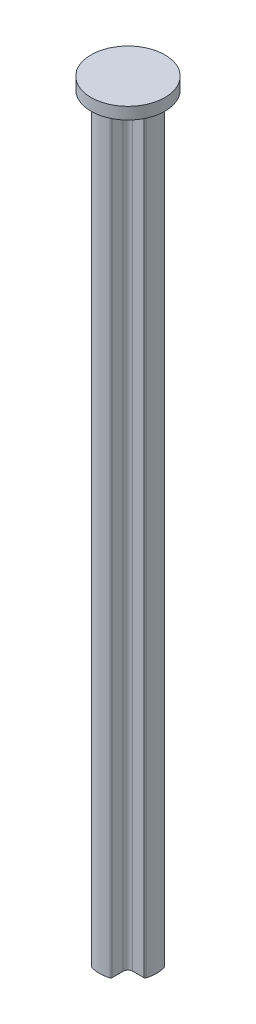
ISO-10303-21;
HEADER;
FILE_DESCRIPTION(('STEP AP214'),'2;1');
FILE_NAME('part.step','',(''),(''),'','','');
FILE_SCHEMA(('AUTOMOTIVE_DESIGN { 1 0 10303 214 1 1 1 1 }'));
ENDSEC;
DATA;
#1=APPLICATION_CONTEXT('core data for automotive mechanical design processes');
#2=APPLICATION_PROTOCOL_DEFINITION('international standard','automotive_design',2000,#1);
#3=PRODUCT_CONTEXT('',#1,'mechanical');
#4=PRODUCT('Part','Part','',(#3));
#5=PRODUCT_RELATED_PRODUCT_CATEGORY('part','',(#4));
#6=PRODUCT_DEFINITION_FORMATION('','',#4);
#7=PRODUCT_DEFINITION_CONTEXT('part definition',#1,'design');
#8=PRODUCT_DEFINITION('design','',#6,#7);
#9=PRODUCT_DEFINITION_SHAPE('','',#8);
#10=(LENGTH_UNIT() NAMED_UNIT(*) SI_UNIT(.MILLI.,.METRE.));
#11=(NAMED_UNIT(*) PLANE_ANGLE_UNIT() SI_UNIT($,.RADIAN.));
#12=(NAMED_UNIT(*) SI_UNIT($,.STERADIAN.) SOLID_ANGLE_UNIT());
#13=UNCERTAINTY_MEASURE_WITH_UNIT(LENGTH_MEASURE(1.E-05),#10,'distance_accuracy_value','');
#14=(GEOMETRIC_REPRESENTATION_CONTEXT(3) GLOBAL_UNCERTAINTY_ASSIGNED_CONTEXT((#13)) GLOBAL_UNIT_ASSIGNED_CONTEXT((#10,
#11,#12)) REPRESENTATION_CONTEXT('',''));
#15=CARTESIAN_POINT('',(0.,0.,0.));
#16=DIRECTION('',(0.,0.,1.));
#17=DIRECTION('',(1.,0.,0.));
#18=AXIS2_PLACEMENT_3D('',#15,#16,#17);
#19=CARTESIAN_POINT('',(0.,64.,0.));
#20=DIRECTION('',(0.,-1.,0.));
#21=DIRECTION('',(0.,0.,-1.));
#22=AXIS2_PLACEMENT_3D('',#19,#20,#21);
#23=CYLINDRICAL_SURFACE('',#22,3.1);
#24=CARTESIAN_POINT('',(0.,63.,0.));
#25=DIRECTION('',(0.,1.,0.));
#26=DIRECTION('',(0.,0.,1.));
#27=AXIS2_PLACEMENT_3D('',#24,#25,#26);
#28=CIRCLE('',#27,3.1);
#29=CARTESIAN_POINT('',(0.,63.,3.1));
#30=VERTEX_POINT('',#29);
#31=EDGE_CURVE('E47',#30,#30,#28,.T.);
#32=ORIENTED_EDGE('',*,*,#31,.T.);
#33=EDGE_LOOP('',(#32));
#34=FACE_BOUND('',#33,.T.);
#35=CARTESIAN_POINT('',(0.,64.,0.));
#36=DIRECTION('',(0.,1.,0.));
#37=DIRECTION('',(0.,0.,1.));
#38=AXIS2_PLACEMENT_3D('',#35,#36,#37);
#39=CIRCLE('',#38,3.1);
#40=CARTESIAN_POINT('',(0.,64.,3.1));
#41=VERTEX_POINT('',#40);
#42=EDGE_CURVE('E11',#41,#41,#39,.T.);
#43=ORIENTED_EDGE('',*,*,#42,.F.);
#44=EDGE_LOOP('',(#43));
#45=FACE_BOUND('',#44,.T.);
#46=ADVANCED_FACE('F39',(#34,#45),#23,.T.);
#47=CARTESIAN_POINT('',(0.,64.,0.));
#48=DIRECTION('',(0.,1.,0.));
#49=DIRECTION('',(0.,0.,1.));
#50=AXIS2_PLACEMENT_3D('',#47,#48,#49);
#51=PLANE('',#50);
#52=ORIENTED_EDGE('',*,*,#42,.T.);
#53=EDGE_LOOP('',(#52));
#54=FACE_BOUND('',#53,.T.);
#55=ADVANCED_FACE('F455',(#54),#51,.T.);
#56=CARTESIAN_POINT('',(0.,63.,0.));
#57=DIRECTION('',(0.,1.,0.));
#58=DIRECTION('',(0.,0.,1.));
#59=AXIS2_PLACEMENT_3D('',#56,#57,#58);
#60=PLANE('',#59);
#61=ORIENTED_EDGE('',*,*,#31,.F.);
#62=EDGE_LOOP('',(#61));
#63=FACE_BOUND('',#62,.T.);
#64=CARTESIAN_POINT('',(0.,63.,0.));
#65=DIRECTION('',(0.,1.,0.));
#66=DIRECTION('',(0.,0.,1.));
#67=AXIS2_PLACEMENT_3D('',#64,#65,#66);
#68=CIRCLE('',#67,2.4);
#69=CARTESIAN_POINT('',(-0.772173913043479,63.,2.27238804961105));
#70=VERTEX_POINT('',#69);
#71=CARTESIAN_POINT('',(0.772173913043478,63.,2.27238804961105));
#72=VERTEX_POINT('',#71);
#73=EDGE_CURVE('E202',#70,#72,#68,.T.);
#74=ORIENTED_EDGE('',*,*,#73,.T.);
#75=CARTESIAN_POINT('',(0.74,63.,2.17770521421059));
#76=DIRECTION('',(0.,1.,0.));
#77=DIRECTION('',(0.,0.,1.));
#78=AXIS2_PLACEMENT_3D('',#75,#76,#77);
#79=CIRCLE('',#78,0.0999999999999998);
#80=CARTESIAN_POINT('',(0.84,63.,2.17770521421059));
#81=VERTEX_POINT('',#80);
#82=EDGE_CURVE('E225',#72,#81,#79,.T.);
#83=ORIENTED_EDGE('',*,*,#82,.T.);
#84=DIRECTION('',(0.,0.,-1.));
#85=VECTOR('',#84,1.);
#86=CARTESIAN_POINT('',(0.84,63.,1.24));
#87=LINE('',#86,#85);
#88=CARTESIAN_POINT('',(0.84,63.,1.24));
#89=VERTEX_POINT('',#88);
#90=EDGE_CURVE('E228',#81,#89,#87,.T.);
#91=ORIENTED_EDGE('',*,*,#90,.T.);
#92=CARTESIAN_POINT('',(1.24,63.,1.24));
#93=DIRECTION('',(0.,-1.,0.));
#94=DIRECTION('',(0.,0.,1.));
#95=AXIS2_PLACEMENT_3D('',#92,#93,#94);
#96=CIRCLE('',#95,0.4);
#97=CARTESIAN_POINT('',(1.24,63.,0.84));
#98=VERTEX_POINT('',#97);
#99=EDGE_CURVE('E233',#89,#98,#96,.T.);
#100=ORIENTED_EDGE('',*,*,#99,.T.);
#101=DIRECTION('',(1.,0.,0.));
#102=VECTOR('',#101,1.);
#103=CARTESIAN_POINT('',(1.24,63.,0.84));
#104=LINE('',#103,#102);
#105=CARTESIAN_POINT('',(2.17770521421059,63.,0.84));
#106=VERTEX_POINT('',#105);
#107=EDGE_CURVE('E236',#98,#106,#104,.T.);
#108=ORIENTED_EDGE('',*,*,#107,.T.);
#109=CARTESIAN_POINT('',(2.17770521421059,63.,0.74));
#110=DIRECTION('',(0.,1.,0.));
#111=DIRECTION('',(0.,0.,-1.));
#112=AXIS2_PLACEMENT_3D('',#109,#110,#111);
#113=CIRCLE('',#112,0.0999999999999996);
#114=CARTESIAN_POINT('',(2.27238804961105,63.,0.772173913043478));
#115=VERTEX_POINT('',#114);
#116=EDGE_CURVE('E239',#106,#115,#113,.T.);
#117=ORIENTED_EDGE('',*,*,#116,.T.);
#118=CARTESIAN_POINT('',(0.,63.,0.));
#119=DIRECTION('',(0.,1.,0.));
#120=DIRECTION('',(0.,0.,1.));
#121=AXIS2_PLACEMENT_3D('',#118,#119,#120);
#122=CIRCLE('',#121,2.4);
#123=CARTESIAN_POINT('',(2.27238804961105,63.,-0.772173913043478));
#124=VERTEX_POINT('',#123);
#125=EDGE_CURVE('E242',#115,#124,#122,.T.);
#126=ORIENTED_EDGE('',*,*,#125,.T.);
#127=CARTESIAN_POINT('',(2.17770521421059,63.,-0.74));
#128=DIRECTION('',(0.,1.,0.));
#129=DIRECTION('',(0.,0.,-1.));
#130=AXIS2_PLACEMENT_3D('',#127,#128,#129);
#131=CIRCLE('',#130,0.0999999999999996);
#132=CARTESIAN_POINT('',(2.17770521421059,63.,-0.84));
#133=VERTEX_POINT('',#132);
#134=EDGE_CURVE('E245',#124,#133,#131,.T.);
#135=ORIENTED_EDGE('',*,*,#134,.T.);
#136=DIRECTION('',(-1.,0.,0.));
#137=VECTOR('',#136,1.);
#138=CARTESIAN_POINT('',(1.24,63.,-0.84));
#139=LINE('',#138,#137);
#140=CARTESIAN_POINT('',(1.24,63.,-0.84));
#141=VERTEX_POINT('',#140);
#142=EDGE_CURVE('E248',#133,#141,#139,.T.);
#143=ORIENTED_EDGE('',*,*,#142,.T.);
#144=CARTESIAN_POINT('',(1.24,63.,-1.24));
#145=DIRECTION('',(0.,-1.,0.));
#146=DIRECTION('',(0.,0.,-1.));
#147=AXIS2_PLACEMENT_3D('',#144,#145,#146);
#148=CIRCLE('',#147,0.4);
#149=CARTESIAN_POINT('',(0.84,63.,-1.24));
#150=VERTEX_POINT('',#149);
#151=EDGE_CURVE('E251',#141,#150,#148,.T.);
#152=ORIENTED_EDGE('',*,*,#151,.T.);
#153=DIRECTION('',(0.,0.,-1.));
#154=VECTOR('',#153,1.);
#155=CARTESIAN_POINT('',(0.84,63.,-2.17770521421059));
#156=LINE('',#155,#154);
#157=CARTESIAN_POINT('',(0.84,63.,-2.17770521421059));
#158=VERTEX_POINT('',#157);
#159=EDGE_CURVE('E254',#150,#158,#156,.T.);
#160=ORIENTED_EDGE('',*,*,#159,.T.);
#161=CARTESIAN_POINT('',(0.74,63.,-2.17770521421059));
#162=DIRECTION('',(0.,1.,0.));
#163=DIRECTION('',(0.,0.,-1.));
#164=AXIS2_PLACEMENT_3D('',#161,#162,#163);
#165=CIRCLE('',#164,0.0999999999999998);
#166=CARTESIAN_POINT('',(0.772173913043478,63.,-2.27238804961105));
#167=VERTEX_POINT('',#166);
#168=EDGE_CURVE('E257',#158,#167,#165,.T.);
#169=ORIENTED_EDGE('',*,*,#168,.T.);
#170=CARTESIAN_POINT('',(0.,63.,0.));
#171=DIRECTION('',(0.,1.,0.));
#172=DIRECTION('',(0.,0.,1.));
#173=AXIS2_PLACEMENT_3D('',#170,#171,#172);
#174=CIRCLE('',#173,2.4);
#175=CARTESIAN_POINT('',(-0.772173913043478,63.,-2.27238804961105));
#176=VERTEX_POINT('',#175);
#177=EDGE_CURVE('E260',#167,#176,#174,.T.);
#178=ORIENTED_EDGE('',*,*,#177,.T.);
#179=CARTESIAN_POINT('',(-0.74,63.,-2.17770521421059));
#180=DIRECTION('',(0.,1.,0.));
#181=DIRECTION('',(0.,0.,1.));
#182=AXIS2_PLACEMENT_3D('',#179,#180,#181);
#183=CIRCLE('',#182,0.0999999999999998);
#184=CARTESIAN_POINT('',(-0.84,63.,-2.17770521421059));
#185=VERTEX_POINT('',#184);
#186=EDGE_CURVE('E263',#176,#185,#183,.T.);
#187=ORIENTED_EDGE('',*,*,#186,.T.);
#188=DIRECTION('',(0.,0.,1.));
#189=VECTOR('',#188,1.);
#190=CARTESIAN_POINT('',(-0.84,63.,-2.17770521421059));
#191=LINE('',#190,#189);
#192=CARTESIAN_POINT('',(-0.84,63.,-1.24));
#193=VERTEX_POINT('',#192);
#194=EDGE_CURVE('E266',#185,#193,#191,.T.);
#195=ORIENTED_EDGE('',*,*,#194,.T.);
#196=CARTESIAN_POINT('',(-1.24,63.,-1.24));
#197=DIRECTION('',(0.,-1.,0.));
#198=DIRECTION('',(0.,0.,-1.));
#199=AXIS2_PLACEMENT_3D('',#196,#197,#198);
#200=CIRCLE('',#199,0.4);
#201=CARTESIAN_POINT('',(-1.24,63.,-0.84));
#202=VERTEX_POINT('',#201);
#203=EDGE_CURVE('E269',#193,#202,#200,.T.);
#204=ORIENTED_EDGE('',*,*,#203,.T.);
#205=DIRECTION('',(-1.,0.,0.));
#206=VECTOR('',#205,1.);
#207=CARTESIAN_POINT('',(-2.17770521421059,63.,-0.84));
#208=LINE('',#207,#206);
#209=CARTESIAN_POINT('',(-2.17770521421059,63.,-0.84));
#210=VERTEX_POINT('',#209);
#211=EDGE_CURVE('E272',#202,#210,#208,.T.);
#212=ORIENTED_EDGE('',*,*,#211,.T.);
#213=CARTESIAN_POINT('',(-2.17770521421059,63.,-0.74));
#214=DIRECTION('',(0.,1.,0.));
#215=DIRECTION('',(0.,0.,1.));
#216=AXIS2_PLACEMENT_3D('',#213,#214,#215);
#217=CIRCLE('',#216,0.0999999999999998);
#218=CARTESIAN_POINT('',(-2.27238804961105,63.,-0.772173913043479));
#219=VERTEX_POINT('',#218);
#220=EDGE_CURVE('E275',#210,#219,#217,.T.);
#221=ORIENTED_EDGE('',*,*,#220,.T.);
#222=CARTESIAN_POINT('',(0.,63.,0.));
#223=DIRECTION('',(0.,1.,0.));
#224=DIRECTION('',(0.,0.,1.));
#225=AXIS2_PLACEMENT_3D('',#222,#223,#224);
#226=CIRCLE('',#225,2.4);
#227=CARTESIAN_POINT('',(-2.27238804961105,63.,0.772173913043478));
#228=VERTEX_POINT('',#227);
#229=EDGE_CURVE('E278',#219,#228,#226,.T.);
#230=ORIENTED_EDGE('',*,*,#229,.T.);
#231=CARTESIAN_POINT('',(-2.17770521421059,63.,0.74));
#232=DIRECTION('',(0.,1.,0.));
#233=DIRECTION('',(0.,0.,1.));
#234=AXIS2_PLACEMENT_3D('',#231,#232,#233);
#235=CIRCLE('',#234,0.0999999999999998);
#236=CARTESIAN_POINT('',(-2.17770521421059,63.,0.84));
#237=VERTEX_POINT('',#236);
#238=EDGE_CURVE('E281',#228,#237,#235,.T.);
#239=ORIENTED_EDGE('',*,*,#238,.T.);
#240=DIRECTION('',(1.,0.,0.));
#241=VECTOR('',#240,1.);
#242=CARTESIAN_POINT('',(-2.17770521421059,63.,0.84));
#243=LINE('',#242,#241);
#244=CARTESIAN_POINT('',(-1.24,63.,0.84));
#245=VERTEX_POINT('',#244);
#246=EDGE_CURVE('E284',#237,#245,#243,.T.);
#247=ORIENTED_EDGE('',*,*,#246,.T.);
#248=CARTESIAN_POINT('',(-1.24,63.,1.24));
#249=DIRECTION('',(0.,-1.,0.));
#250=DIRECTION('',(0.,0.,-1.));
#251=AXIS2_PLACEMENT_3D('',#248,#249,#250);
#252=CIRCLE('',#251,0.4);
#253=CARTESIAN_POINT('',(-0.84,63.,1.24));
#254=VERTEX_POINT('',#253);
#255=EDGE_CURVE('E287',#245,#254,#252,.T.);
#256=ORIENTED_EDGE('',*,*,#255,.T.);
#257=DIRECTION('',(0.,0.,1.));
#258=VECTOR('',#257,1.);
#259=CARTESIAN_POINT('',(-0.84,63.,1.24));
#260=LINE('',#259,#258);
#261=CARTESIAN_POINT('',(-0.84,63.,2.17770521421059));
#262=VERTEX_POINT('',#261);
#263=EDGE_CURVE('E205',#254,#262,#260,.T.);
#264=ORIENTED_EDGE('',*,*,#263,.T.);
#265=CARTESIAN_POINT('',(-0.74,63.,2.17770521421059));
#266=DIRECTION('',(0.,1.,0.));
#267=DIRECTION('',(0.,0.,1.));
#268=AXIS2_PLACEMENT_3D('',#265,#266,#267);
#269=CIRCLE('',#268,0.0999999999999998);
#270=EDGE_CURVE('E198',#262,#70,#269,.T.);
#271=ORIENTED_EDGE('',*,*,#270,.T.);
#272=EDGE_LOOP('',(#74,#83,#91,#100,#108,#117,#126,#135,#143,#152,#160,#169,#178,#187,#195,#204,
#212,#221,#230,#239,#247,#256,#264,#271));
#273=FACE_BOUND('',#272,.T.);
#274=ADVANCED_FACE('F200',(#63,#273),#60,.F.);
#275=CARTESIAN_POINT('',(-0.74,63.,2.17770521421059));
#276=DIRECTION('',(0.,-1.,0.));
#277=DIRECTION('',(0.,0.,-1.));
#278=AXIS2_PLACEMENT_3D('',#275,#276,#277);
#279=CYLINDRICAL_SURFACE('',#278,0.0999999999999998);
#280=CARTESIAN_POINT('',(-0.74,0.,2.17770521421059));
#281=DIRECTION('',(0.,1.,0.));
#282=DIRECTION('',(0.,0.,1.));
#283=AXIS2_PLACEMENT_3D('',#280,#281,#282);
#284=CIRCLE('',#283,0.0999999999999998);
#285=CARTESIAN_POINT('',(-0.84,0.,2.17770521421059));
#286=VERTEX_POINT('',#285);
#287=CARTESIAN_POINT('',(-0.772173913043479,0.,2.27238804961105));
#288=VERTEX_POINT('',#287);
#289=EDGE_CURVE('E215',#286,#288,#284,.T.);
#290=ORIENTED_EDGE('',*,*,#289,.T.);
#291=DIRECTION('',(0.,-1.,0.));
#292=VECTOR('',#291,1.);
#293=CARTESIAN_POINT('',(-0.772173913043479,63.,2.27238804961105));
#294=LINE('',#293,#292);
#295=EDGE_CURVE('E212',#70,#288,#294,.T.);
#296=ORIENTED_EDGE('',*,*,#295,.F.);
#297=ORIENTED_EDGE('',*,*,#270,.F.);
#298=DIRECTION('',(0.,-1.,0.));
#299=VECTOR('',#298,1.);
#300=CARTESIAN_POINT('',(-0.84,63.,2.17770521421059));
#301=LINE('',#300,#299);
#302=EDGE_CURVE('E292',#262,#286,#301,.T.);
#303=ORIENTED_EDGE('',*,*,#302,.T.);
#304=EDGE_LOOP('',(#290,#296,#297,#303));
#305=FACE_BOUND('',#304,.T.);
#306=ADVANCED_FACE('F213',(#305),#279,.T.);
#307=CARTESIAN_POINT('',(0.,63.,0.));
#308=DIRECTION('',(0.,-1.,0.));
#309=DIRECTION('',(0.,0.,-1.));
#310=AXIS2_PLACEMENT_3D('',#307,#308,#309);
#311=CYLINDRICAL_SURFACE('',#310,2.4);
#312=CARTESIAN_POINT('',(0.,0.,0.));
#313=DIRECTION('',(0.,1.,0.));
#314=DIRECTION('',(0.,0.,1.));
#315=AXIS2_PLACEMENT_3D('',#312,#313,#314);
#316=CIRCLE('',#315,2.4);
#317=CARTESIAN_POINT('',(0.772173913043478,0.,2.27238804961105));
#318=VERTEX_POINT('',#317);
#319=EDGE_CURVE('E295',#288,#318,#316,.T.);
#320=ORIENTED_EDGE('',*,*,#319,.T.);
#321=DIRECTION('',(0.,-1.,0.));
#322=VECTOR('',#321,1.);
#323=CARTESIAN_POINT('',(0.772173913043478,63.,2.27238804961105));
#324=LINE('',#323,#322);
#325=EDGE_CURVE('E220',#72,#318,#324,.T.);
#326=ORIENTED_EDGE('',*,*,#325,.F.);
#327=ORIENTED_EDGE('',*,*,#73,.F.);
#328=ORIENTED_EDGE('',*,*,#295,.T.);
#329=EDGE_LOOP('',(#320,#326,#327,#328));
#330=FACE_BOUND('',#329,.T.);
#331=ADVANCED_FACE('F222',(#330),#311,.T.);
#332=CARTESIAN_POINT('',(0.74,63.,2.17770521421059));
#333=DIRECTION('',(0.,-1.,0.));
#334=DIRECTION('',(0.,0.,-1.));
#335=AXIS2_PLACEMENT_3D('',#332,#333,#334);
#336=CYLINDRICAL_SURFACE('',#335,0.0999999999999998);
#337=CARTESIAN_POINT('',(0.74,0.,2.17770521421059));
#338=DIRECTION('',(0.,1.,0.));
#339=DIRECTION('',(0.,0.,1.));
#340=AXIS2_PLACEMENT_3D('',#337,#338,#339);
#341=CIRCLE('',#340,0.0999999999999998);
#342=CARTESIAN_POINT('',(0.84,0.,2.17770521421059));
#343=VERTEX_POINT('',#342);
#344=EDGE_CURVE('E298',#318,#343,#341,.T.);
#345=ORIENTED_EDGE('',*,*,#344,.T.);
#346=DIRECTION('',(0.,-1.,0.));
#347=VECTOR('',#346,1.);
#348=CARTESIAN_POINT('',(0.84,63.,2.17770521421059));
#349=LINE('',#348,#347);
#350=EDGE_CURVE('E444',#81,#343,#349,.T.);
#351=ORIENTED_EDGE('',*,*,#350,.F.);
#352=ORIENTED_EDGE('',*,*,#82,.F.);
#353=ORIENTED_EDGE('',*,*,#325,.T.);
#354=EDGE_LOOP('',(#345,#351,#352,#353));
#355=FACE_BOUND('',#354,.T.);
#356=ADVANCED_FACE('F502',(#355),#336,.T.);
#357=CARTESIAN_POINT('',(0.84,63.,1.24));
#358=DIRECTION('',(-1.,0.,0.));
#359=DIRECTION('',(0.,0.,1.));
#360=AXIS2_PLACEMENT_3D('',#357,#358,#359);
#361=PLANE('',#360);
#362=DIRECTION('',(0.,0.,-1.));
#363=VECTOR('',#362,1.);
#364=CARTESIAN_POINT('',(0.84,0.,1.24));
#365=LINE('',#364,#363);
#366=CARTESIAN_POINT('',(0.84,0.,1.24));
#367=VERTEX_POINT('',#366);
#368=EDGE_CURVE('E302',#343,#367,#365,.T.);
#369=ORIENTED_EDGE('',*,*,#368,.T.);
#370=DIRECTION('',(0.,-1.,0.));
#371=VECTOR('',#370,1.);
#372=CARTESIAN_POINT('',(0.84,63.,1.24));
#373=LINE('',#372,#371);
#374=EDGE_CURVE('E441',#89,#367,#373,.T.);
#375=ORIENTED_EDGE('',*,*,#374,.F.);
#376=ORIENTED_EDGE('',*,*,#90,.F.);
#377=ORIENTED_EDGE('',*,*,#350,.T.);
#378=EDGE_LOOP('',(#369,#375,#376,#377));
#379=FACE_BOUND('',#378,.T.);
#380=ADVANCED_FACE('F510',(#379),#361,.F.);
#381=CARTESIAN_POINT('',(1.24,63.,1.24));
#382=DIRECTION('',(0.,-1.,0.));
#383=DIRECTION('',(0.,0.,-1.));
#384=AXIS2_PLACEMENT_3D('',#381,#382,#383);
#385=CYLINDRICAL_SURFACE('',#384,0.4);
#386=CARTESIAN_POINT('',(1.24,0.,1.24));
#387=DIRECTION('',(0.,-1.,0.));
#388=DIRECTION('',(0.,0.,1.));
#389=AXIS2_PLACEMENT_3D('',#386,#387,#388);
#390=CIRCLE('',#389,0.4);
#391=CARTESIAN_POINT('',(1.24,0.,0.84));
#392=VERTEX_POINT('',#391);
#393=EDGE_CURVE('E306',#367,#392,#390,.T.);
#394=ORIENTED_EDGE('',*,*,#393,.T.);
#395=DIRECTION('',(0.,-1.,0.));
#396=VECTOR('',#395,1.);
#397=CARTESIAN_POINT('',(1.24,63.,0.84));
#398=LINE('',#397,#396);
#399=EDGE_CURVE('E438',#98,#392,#398,.T.);
#400=ORIENTED_EDGE('',*,*,#399,.F.);
#401=ORIENTED_EDGE('',*,*,#99,.F.);
#402=ORIENTED_EDGE('',*,*,#374,.T.);
#403=EDGE_LOOP('',(#394,#400,#401,#402));
#404=FACE_BOUND('',#403,.T.);
#405=ADVANCED_FACE('F519',(#404),#385,.F.);
#406=CARTESIAN_POINT('',(1.24,63.,0.84));
#407=DIRECTION('',(0.,0.,-1.));
#408=DIRECTION('',(-1.,0.,0.));
#409=AXIS2_PLACEMENT_3D('',#406,#407,#408);
#410=PLANE('',#409);
#411=DIRECTION('',(1.,0.,0.));
#412=VECTOR('',#411,1.);
#413=CARTESIAN_POINT('',(1.24,0.,0.84));
#414=LINE('',#413,#412);
#415=CARTESIAN_POINT('',(2.17770521421059,0.,0.84));
#416=VERTEX_POINT('',#415);
#417=EDGE_CURVE('E310',#392,#416,#414,.T.);
#418=ORIENTED_EDGE('',*,*,#417,.T.);
#419=DIRECTION('',(0.,-1.,0.));
#420=VECTOR('',#419,1.);
#421=CARTESIAN_POINT('',(2.17770521421059,63.,0.84));
#422=LINE('',#421,#420);
#423=EDGE_CURVE('E435',#106,#416,#422,.T.);
#424=ORIENTED_EDGE('',*,*,#423,.F.);
#425=ORIENTED_EDGE('',*,*,#107,.F.);
#426=ORIENTED_EDGE('',*,*,#399,.T.);
#427=EDGE_LOOP('',(#418,#424,#425,#426));
#428=FACE_BOUND('',#427,.T.);
#429=ADVANCED_FACE('F528',(#428),#410,.F.);
#430=CARTESIAN_POINT('',(2.17770521421059,63.,0.74));
#431=DIRECTION('',(0.,-1.,0.));
#432=DIRECTION('',(0.,0.,-1.));
#433=AXIS2_PLACEMENT_3D('',#430,#431,#432);
#434=CYLINDRICAL_SURFACE('',#433,0.0999999999999996);
#435=CARTESIAN_POINT('',(2.17770521421059,0.,0.74));
#436=DIRECTION('',(0.,1.,0.));
#437=DIRECTION('',(0.,0.,-1.));
#438=AXIS2_PLACEMENT_3D('',#435,#436,#437);
#439=CIRCLE('',#438,0.0999999999999996);
#440=CARTESIAN_POINT('',(2.27238804961105,0.,0.772173913043478));
#441=VERTEX_POINT('',#440);
#442=EDGE_CURVE('E314',#416,#441,#439,.T.);
#443=ORIENTED_EDGE('',*,*,#442,.T.);
#444=DIRECTION('',(0.,-1.,0.));
#445=VECTOR('',#444,1.);
#446=CARTESIAN_POINT('',(2.27238804961105,63.,0.772173913043478));
#447=LINE('',#446,#445);
#448=EDGE_CURVE('E432',#115,#441,#447,.T.);
#449=ORIENTED_EDGE('',*,*,#448,.F.);
#450=ORIENTED_EDGE('',*,*,#116,.F.);
#451=ORIENTED_EDGE('',*,*,#423,.T.);
#452=EDGE_LOOP('',(#443,#449,#450,#451));
#453=FACE_BOUND('',#452,.T.);
#454=ADVANCED_FACE('F537',(#453),#434,.T.);
#455=CARTESIAN_POINT('',(0.,63.,0.));
#456=DIRECTION('',(0.,-1.,0.));
#457=DIRECTION('',(0.,0.,-1.));
#458=AXIS2_PLACEMENT_3D('',#455,#456,#457);
#459=CYLINDRICAL_SURFACE('',#458,2.4);
#460=CARTESIAN_POINT('',(0.,0.,0.));
#461=DIRECTION('',(0.,1.,0.));
#462=DIRECTION('',(0.,0.,1.));
#463=AXIS2_PLACEMENT_3D('',#460,#461,#462);
#464=CIRCLE('',#463,2.4);
#465=CARTESIAN_POINT('',(2.27238804961105,0.,-0.772173913043478));
#466=VERTEX_POINT('',#465);
#467=EDGE_CURVE('E318',#441,#466,#464,.T.);
#468=ORIENTED_EDGE('',*,*,#467,.T.);
#469=DIRECTION('',(0.,-1.,0.));
#470=VECTOR('',#469,1.);
#471=CARTESIAN_POINT('',(2.27238804961105,63.,-0.772173913043478));
#472=LINE('',#471,#470);
#473=EDGE_CURVE('E429',#124,#466,#472,.T.);
#474=ORIENTED_EDGE('',*,*,#473,.F.);
#475=ORIENTED_EDGE('',*,*,#125,.F.);
#476=ORIENTED_EDGE('',*,*,#448,.T.);
#477=EDGE_LOOP('',(#468,#474,#475,#476));
#478=FACE_BOUND('',#477,.T.);
#479=ADVANCED_FACE('F546',(#478),#459,.T.);
#480=CARTESIAN_POINT('',(2.17770521421059,63.,-0.74));
#481=DIRECTION('',(0.,-1.,0.));
#482=DIRECTION('',(0.,0.,-1.));
#483=AXIS2_PLACEMENT_3D('',#480,#481,#482);
#484=CYLINDRICAL_SURFACE('',#483,0.0999999999999996);
#485=CARTESIAN_POINT('',(2.17770521421059,0.,-0.74));
#486=DIRECTION('',(0.,1.,0.));
#487=DIRECTION('',(0.,0.,-1.));
#488=AXIS2_PLACEMENT_3D('',#485,#486,#487);
#489=CIRCLE('',#488,0.0999999999999996);
#490=CARTESIAN_POINT('',(2.17770521421059,0.,-0.84));
#491=VERTEX_POINT('',#490);
#492=EDGE_CURVE('E322',#466,#491,#489,.T.);
#493=ORIENTED_EDGE('',*,*,#492,.T.);
#494=DIRECTION('',(0.,-1.,0.));
#495=VECTOR('',#494,1.);
#496=CARTESIAN_POINT('',(2.17770521421059,63.,-0.84));
#497=LINE('',#496,#495);
#498=EDGE_CURVE('E426',#133,#491,#497,.T.);
#499=ORIENTED_EDGE('',*,*,#498,.F.);
#500=ORIENTED_EDGE('',*,*,#134,.F.);
#501=ORIENTED_EDGE('',*,*,#473,.T.);
#502=EDGE_LOOP('',(#493,#499,#500,#501));
#503=FACE_BOUND('',#502,.T.);
#504=ADVANCED_FACE('F555',(#503),#484,.T.);
#505=CARTESIAN_POINT('',(1.24,63.,-0.84));
#506=DIRECTION('',(0.,0.,1.));
#507=DIRECTION('',(1.,0.,0.));
#508=AXIS2_PLACEMENT_3D('',#505,#506,#507);
#509=PLANE('',#508);
#510=DIRECTION('',(-1.,0.,0.));
#511=VECTOR('',#510,1.);
#512=CARTESIAN_POINT('',(1.24,0.,-0.84));
#513=LINE('',#512,#511);
#514=CARTESIAN_POINT('',(1.24,0.,-0.84));
#515=VERTEX_POINT('',#514);
#516=EDGE_CURVE('E326',#491,#515,#513,.T.);
#517=ORIENTED_EDGE('',*,*,#516,.T.);
#518=DIRECTION('',(0.,-1.,0.));
#519=VECTOR('',#518,1.);
#520=CARTESIAN_POINT('',(1.24,63.,-0.84));
#521=LINE('',#520,#519);
#522=EDGE_CURVE('E423',#141,#515,#521,.T.);
#523=ORIENTED_EDGE('',*,*,#522,.F.);
#524=ORIENTED_EDGE('',*,*,#142,.F.);
#525=ORIENTED_EDGE('',*,*,#498,.T.);
#526=EDGE_LOOP('',(#517,#523,#524,#525));
#527=FACE_BOUND('',#526,.T.);
#528=ADVANCED_FACE('F564',(#527),#509,.F.);
#529=CARTESIAN_POINT('',(1.24,63.,-1.24));
#530=DIRECTION('',(0.,-1.,0.));
#531=DIRECTION('',(0.,0.,-1.));
#532=AXIS2_PLACEMENT_3D('',#529,#530,#531);
#533=CYLINDRICAL_SURFACE('',#532,0.4);
#534=CARTESIAN_POINT('',(1.24,0.,-1.24));
#535=DIRECTION('',(0.,-1.,0.));
#536=DIRECTION('',(0.,0.,-1.));
#537=AXIS2_PLACEMENT_3D('',#534,#535,#536);
#538=CIRCLE('',#537,0.4);
#539=CARTESIAN_POINT('',(0.84,0.,-1.24));
#540=VERTEX_POINT('',#539);
#541=EDGE_CURVE('E330',#515,#540,#538,.T.);
#542=ORIENTED_EDGE('',*,*,#541,.T.);
#543=DIRECTION('',(0.,-1.,0.));
#544=VECTOR('',#543,1.);
#545=CARTESIAN_POINT('',(0.84,63.,-1.24));
#546=LINE('',#545,#544);
#547=EDGE_CURVE('E420',#150,#540,#546,.T.);
#548=ORIENTED_EDGE('',*,*,#547,.F.);
#549=ORIENTED_EDGE('',*,*,#151,.F.);
#550=ORIENTED_EDGE('',*,*,#522,.T.);
#551=EDGE_LOOP('',(#542,#548,#549,#550));
#552=FACE_BOUND('',#551,.T.);
#553=ADVANCED_FACE('F573',(#552),#533,.F.);
#554=CARTESIAN_POINT('',(0.84,63.,-2.17770521421059));
#555=DIRECTION('',(-1.,0.,0.));
#556=DIRECTION('',(0.,0.,1.));
#557=AXIS2_PLACEMENT_3D('',#554,#555,#556);
#558=PLANE('',#557);
#559=DIRECTION('',(0.,0.,-1.));
#560=VECTOR('',#559,1.);
#561=CARTESIAN_POINT('',(0.84,0.,-2.17770521421059));
#562=LINE('',#561,#560);
#563=CARTESIAN_POINT('',(0.84,0.,-2.17770521421059));
#564=VERTEX_POINT('',#563);
#565=EDGE_CURVE('E334',#540,#564,#562,.T.);
#566=ORIENTED_EDGE('',*,*,#565,.T.);
#567=DIRECTION('',(0.,-1.,0.));
#568=VECTOR('',#567,1.);
#569=CARTESIAN_POINT('',(0.84,63.,-2.17770521421059));
#570=LINE('',#569,#568);
#571=EDGE_CURVE('E417',#158,#564,#570,.T.);
#572=ORIENTED_EDGE('',*,*,#571,.F.);
#573=ORIENTED_EDGE('',*,*,#159,.F.);
#574=ORIENTED_EDGE('',*,*,#547,.T.);
#575=EDGE_LOOP('',(#566,#572,#573,#574));
#576=FACE_BOUND('',#575,.T.);
#577=ADVANCED_FACE('F582',(#576),#558,.F.);
#578=CARTESIAN_POINT('',(0.74,63.,-2.17770521421059));
#579=DIRECTION('',(0.,-1.,0.));
#580=DIRECTION('',(0.,0.,-1.));
#581=AXIS2_PLACEMENT_3D('',#578,#579,#580);
#582=CYLINDRICAL_SURFACE('',#581,0.0999999999999998);
#583=CARTESIAN_POINT('',(0.74,0.,-2.17770521421059));
#584=DIRECTION('',(0.,1.,0.));
#585=DIRECTION('',(0.,0.,-1.));
#586=AXIS2_PLACEMENT_3D('',#583,#584,#585);
#587=CIRCLE('',#586,0.0999999999999998);
#588=CARTESIAN_POINT('',(0.772173913043478,0.,-2.27238804961105));
#589=VERTEX_POINT('',#588);
#590=EDGE_CURVE('E338',#564,#589,#587,.T.);
#591=ORIENTED_EDGE('',*,*,#590,.T.);
#592=DIRECTION('',(0.,-1.,0.));
#593=VECTOR('',#592,1.);
#594=CARTESIAN_POINT('',(0.772173913043478,63.,-2.27238804961105));
#595=LINE('',#594,#593);
#596=EDGE_CURVE('E414',#167,#589,#595,.T.);
#597=ORIENTED_EDGE('',*,*,#596,.F.);
#598=ORIENTED_EDGE('',*,*,#168,.F.);
#599=ORIENTED_EDGE('',*,*,#571,.T.);
#600=EDGE_LOOP('',(#591,#597,#598,#599));
#601=FACE_BOUND('',#600,.T.);
#602=ADVANCED_FACE('F591',(#601),#582,.T.);
#603=CARTESIAN_POINT('',(0.,63.,0.));
#604=DIRECTION('',(0.,-1.,0.));
#605=DIRECTION('',(0.,0.,-1.));
#606=AXIS2_PLACEMENT_3D('',#603,#604,#605);
#607=CYLINDRICAL_SURFACE('',#606,2.4);
#608=CARTESIAN_POINT('',(0.,0.,0.));
#609=DIRECTION('',(0.,1.,0.));
#610=DIRECTION('',(0.,0.,1.));
#611=AXIS2_PLACEMENT_3D('',#608,#609,#610);
#612=CIRCLE('',#611,2.4);
#613=CARTESIAN_POINT('',(-0.772173913043478,0.,-2.27238804961105));
#614=VERTEX_POINT('',#613);
#615=EDGE_CURVE('E342',#589,#614,#612,.T.);
#616=ORIENTED_EDGE('',*,*,#615,.T.);
#617=DIRECTION('',(0.,-1.,0.));
#618=VECTOR('',#617,1.);
#619=CARTESIAN_POINT('',(-0.772173913043478,63.,-2.27238804961105));
#620=LINE('',#619,#618);
#621=EDGE_CURVE('E411',#176,#614,#620,.T.);
#622=ORIENTED_EDGE('',*,*,#621,.F.);
#623=ORIENTED_EDGE('',*,*,#177,.F.);
#624=ORIENTED_EDGE('',*,*,#596,.T.);
#625=EDGE_LOOP('',(#616,#622,#623,#624));
#626=FACE_BOUND('',#625,.T.);
#627=ADVANCED_FACE('F600',(#626),#607,.T.);
#628=CARTESIAN_POINT('',(-0.74,63.,-2.17770521421059));
#629=DIRECTION('',(0.,-1.,0.));
#630=DIRECTION('',(0.,0.,-1.));
#631=AXIS2_PLACEMENT_3D('',#628,#629,#630);
#632=CYLINDRICAL_SURFACE('',#631,0.0999999999999998);
#633=CARTESIAN_POINT('',(-0.74,0.,-2.17770521421059));
#634=DIRECTION('',(0.,1.,0.));
#635=DIRECTION('',(0.,0.,1.));
#636=AXIS2_PLACEMENT_3D('',#633,#634,#635);
#637=CIRCLE('',#636,0.0999999999999998);
#638=CARTESIAN_POINT('',(-0.84,0.,-2.17770521421059));
#639=VERTEX_POINT('',#638);
#640=EDGE_CURVE('E346',#614,#639,#637,.T.);
#641=ORIENTED_EDGE('',*,*,#640,.T.);
#642=DIRECTION('',(0.,-1.,0.));
#643=VECTOR('',#642,1.);
#644=CARTESIAN_POINT('',(-0.84,63.,-2.17770521421059));
#645=LINE('',#644,#643);
#646=EDGE_CURVE('E408',#185,#639,#645,.T.);
#647=ORIENTED_EDGE('',*,*,#646,.F.);
#648=ORIENTED_EDGE('',*,*,#186,.F.);
#649=ORIENTED_EDGE('',*,*,#621,.T.);
#650=EDGE_LOOP('',(#641,#647,#648,#649));
#651=FACE_BOUND('',#650,.T.);
#652=ADVANCED_FACE('F609',(#651),#632,.T.);
#653=CARTESIAN_POINT('',(-0.84,63.,-2.17770521421059));
#654=DIRECTION('',(1.,0.,0.));
#655=DIRECTION('',(0.,0.,-1.));
#656=AXIS2_PLACEMENT_3D('',#653,#654,#655);
#657=PLANE('',#656);
#658=DIRECTION('',(0.,0.,1.));
#659=VECTOR('',#658,1.);
#660=CARTESIAN_POINT('',(-0.84,0.,-2.17770521421059));
#661=LINE('',#660,#659);
#662=CARTESIAN_POINT('',(-0.84,0.,-1.24));
#663=VERTEX_POINT('',#662);
#664=EDGE_CURVE('E350',#639,#663,#661,.T.);
#665=ORIENTED_EDGE('',*,*,#664,.T.);
#666=DIRECTION('',(0.,-1.,0.));
#667=VECTOR('',#666,1.);
#668=CARTESIAN_POINT('',(-0.84,63.,-1.24));
#669=LINE('',#668,#667);
#670=EDGE_CURVE('E405',#193,#663,#669,.T.);
#671=ORIENTED_EDGE('',*,*,#670,.F.);
#672=ORIENTED_EDGE('',*,*,#194,.F.);
#673=ORIENTED_EDGE('',*,*,#646,.T.);
#674=EDGE_LOOP('',(#665,#671,#672,#673));
#675=FACE_BOUND('',#674,.T.);
#676=ADVANCED_FACE('F618',(#675),#657,.F.);
#677=CARTESIAN_POINT('',(-1.24,63.,-1.24));
#678=DIRECTION('',(0.,-1.,0.));
#679=DIRECTION('',(0.,0.,-1.));
#680=AXIS2_PLACEMENT_3D('',#677,#678,#679);
#681=CYLINDRICAL_SURFACE('',#680,0.4);
#682=CARTESIAN_POINT('',(-1.24,0.,-1.24));
#683=DIRECTION('',(0.,-1.,0.));
#684=DIRECTION('',(0.,0.,-1.));
#685=AXIS2_PLACEMENT_3D('',#682,#683,#684);
#686=CIRCLE('',#685,0.4);
#687=CARTESIAN_POINT('',(-1.24,0.,-0.84));
#688=VERTEX_POINT('',#687);
#689=EDGE_CURVE('E354',#663,#688,#686,.T.);
#690=ORIENTED_EDGE('',*,*,#689,.T.);
#691=DIRECTION('',(0.,-1.,0.));
#692=VECTOR('',#691,1.);
#693=CARTESIAN_POINT('',(-1.24,63.,-0.84));
#694=LINE('',#693,#692);
#695=EDGE_CURVE('E402',#202,#688,#694,.T.);
#696=ORIENTED_EDGE('',*,*,#695,.F.);
#697=ORIENTED_EDGE('',*,*,#203,.F.);
#698=ORIENTED_EDGE('',*,*,#670,.T.);
#699=EDGE_LOOP('',(#690,#696,#697,#698));
#700=FACE_BOUND('',#699,.T.);
#701=ADVANCED_FACE('F627',(#700),#681,.F.);
#702=CARTESIAN_POINT('',(-2.17770521421059,63.,-0.84));
#703=DIRECTION('',(0.,0.,1.));
#704=DIRECTION('',(1.,0.,0.));
#705=AXIS2_PLACEMENT_3D('',#702,#703,#704);
#706=PLANE('',#705);
#707=DIRECTION('',(-1.,0.,0.));
#708=VECTOR('',#707,1.);
#709=CARTESIAN_POINT('',(-2.17770521421059,0.,-0.84));
#710=LINE('',#709,#708);
#711=CARTESIAN_POINT('',(-2.17770521421059,0.,-0.84));
#712=VERTEX_POINT('',#711);
#713=EDGE_CURVE('E358',#688,#712,#710,.T.);
#714=ORIENTED_EDGE('',*,*,#713,.T.);
#715=DIRECTION('',(0.,-1.,0.));
#716=VECTOR('',#715,1.);
#717=CARTESIAN_POINT('',(-2.17770521421059,63.,-0.84));
#718=LINE('',#717,#716);
#719=EDGE_CURVE('E399',#210,#712,#718,.T.);
#720=ORIENTED_EDGE('',*,*,#719,.F.);
#721=ORIENTED_EDGE('',*,*,#211,.F.);
#722=ORIENTED_EDGE('',*,*,#695,.T.);
#723=EDGE_LOOP('',(#714,#720,#721,#722));
#724=FACE_BOUND('',#723,.T.);
#725=ADVANCED_FACE('F636',(#724),#706,.F.);
#726=CARTESIAN_POINT('',(-2.17770521421059,63.,-0.74));
#727=DIRECTION('',(0.,-1.,0.));
#728=DIRECTION('',(0.,0.,-1.));
#729=AXIS2_PLACEMENT_3D('',#726,#727,#728);
#730=CYLINDRICAL_SURFACE('',#729,0.0999999999999998);
#731=CARTESIAN_POINT('',(-2.17770521421059,0.,-0.74));
#732=DIRECTION('',(0.,1.,0.));
#733=DIRECTION('',(0.,0.,1.));
#734=AXIS2_PLACEMENT_3D('',#731,#732,#733);
#735=CIRCLE('',#734,0.0999999999999998);
#736=CARTESIAN_POINT('',(-2.27238804961105,0.,-0.772173913043479));
#737=VERTEX_POINT('',#736);
#738=EDGE_CURVE('E362',#712,#737,#735,.T.);
#739=ORIENTED_EDGE('',*,*,#738,.T.);
#740=DIRECTION('',(0.,-1.,0.));
#741=VECTOR('',#740,1.);
#742=CARTESIAN_POINT('',(-2.27238804961105,63.,-0.772173913043479));
#743=LINE('',#742,#741);
#744=EDGE_CURVE('E396',#219,#737,#743,.T.);
#745=ORIENTED_EDGE('',*,*,#744,.F.);
#746=ORIENTED_EDGE('',*,*,#220,.F.);
#747=ORIENTED_EDGE('',*,*,#719,.T.);
#748=EDGE_LOOP('',(#739,#745,#746,#747));
#749=FACE_BOUND('',#748,.T.);
#750=ADVANCED_FACE('F645',(#749),#730,.T.);
#751=CARTESIAN_POINT('',(0.,63.,0.));
#752=DIRECTION('',(0.,-1.,0.));
#753=DIRECTION('',(0.,0.,-1.));
#754=AXIS2_PLACEMENT_3D('',#751,#752,#753);
#755=CYLINDRICAL_SURFACE('',#754,2.4);
#756=CARTESIAN_POINT('',(0.,0.,0.));
#757=DIRECTION('',(0.,1.,0.));
#758=DIRECTION('',(0.,0.,1.));
#759=AXIS2_PLACEMENT_3D('',#756,#757,#758);
#760=CIRCLE('',#759,2.4);
#761=CARTESIAN_POINT('',(-2.27238804961105,0.,0.772173913043478));
#762=VERTEX_POINT('',#761);
#763=EDGE_CURVE('E366',#737,#762,#760,.T.);
#764=ORIENTED_EDGE('',*,*,#763,.T.);
#765=DIRECTION('',(0.,-1.,0.));
#766=VECTOR('',#765,1.);
#767=CARTESIAN_POINT('',(-2.27238804961105,63.,0.772173913043478));
#768=LINE('',#767,#766);
#769=EDGE_CURVE('E393',#228,#762,#768,.T.);
#770=ORIENTED_EDGE('',*,*,#769,.F.);
#771=ORIENTED_EDGE('',*,*,#229,.F.);
#772=ORIENTED_EDGE('',*,*,#744,.T.);
#773=EDGE_LOOP('',(#764,#770,#771,#772));
#774=FACE_BOUND('',#773,.T.);
#775=ADVANCED_FACE('F654',(#774),#755,.T.);
#776=CARTESIAN_POINT('',(-2.17770521421059,63.,0.74));
#777=DIRECTION('',(0.,-1.,0.));
#778=DIRECTION('',(0.,0.,-1.));
#779=AXIS2_PLACEMENT_3D('',#776,#777,#778);
#780=CYLINDRICAL_SURFACE('',#779,0.0999999999999998);
#781=CARTESIAN_POINT('',(-2.17770521421059,0.,0.74));
#782=DIRECTION('',(0.,1.,0.));
#783=DIRECTION('',(0.,0.,1.));
#784=AXIS2_PLACEMENT_3D('',#781,#782,#783);
#785=CIRCLE('',#784,0.0999999999999998);
#786=CARTESIAN_POINT('',(-2.17770521421059,0.,0.84));
#787=VERTEX_POINT('',#786);
#788=EDGE_CURVE('E370',#762,#787,#785,.T.);
#789=ORIENTED_EDGE('',*,*,#788,.T.);
#790=DIRECTION('',(0.,-1.,0.));
#791=VECTOR('',#790,1.);
#792=CARTESIAN_POINT('',(-2.17770521421059,63.,0.84));
#793=LINE('',#792,#791);
#794=EDGE_CURVE('E390',#237,#787,#793,.T.);
#795=ORIENTED_EDGE('',*,*,#794,.F.);
#796=ORIENTED_EDGE('',*,*,#238,.F.);
#797=ORIENTED_EDGE('',*,*,#769,.T.);
#798=EDGE_LOOP('',(#789,#795,#796,#797));
#799=FACE_BOUND('',#798,.T.);
#800=ADVANCED_FACE('F663',(#799),#780,.T.);
#801=CARTESIAN_POINT('',(-2.17770521421059,63.,0.84));
#802=DIRECTION('',(0.,0.,-1.));
#803=DIRECTION('',(-1.,0.,0.));
#804=AXIS2_PLACEMENT_3D('',#801,#802,#803);
#805=PLANE('',#804);
#806=DIRECTION('',(1.,0.,0.));
#807=VECTOR('',#806,1.);
#808=CARTESIAN_POINT('',(-2.17770521421059,0.,0.84));
#809=LINE('',#808,#807);
#810=CARTESIAN_POINT('',(-1.24,0.,0.84));
#811=VERTEX_POINT('',#810);
#812=EDGE_CURVE('E374',#787,#811,#809,.T.);
#813=ORIENTED_EDGE('',*,*,#812,.T.);
#814=DIRECTION('',(0.,-1.,0.));
#815=VECTOR('',#814,1.);
#816=CARTESIAN_POINT('',(-1.24,63.,0.84));
#817=LINE('',#816,#815);
#818=EDGE_CURVE('E387',#245,#811,#817,.T.);
#819=ORIENTED_EDGE('',*,*,#818,.F.);
#820=ORIENTED_EDGE('',*,*,#246,.F.);
#821=ORIENTED_EDGE('',*,*,#794,.T.);
#822=EDGE_LOOP('',(#813,#819,#820,#821));
#823=FACE_BOUND('',#822,.T.);
#824=ADVANCED_FACE('F672',(#823),#805,.F.);
#825=CARTESIAN_POINT('',(-1.24,63.,1.24));
#826=DIRECTION('',(0.,-1.,0.));
#827=DIRECTION('',(0.,0.,-1.));
#828=AXIS2_PLACEMENT_3D('',#825,#826,#827);
#829=CYLINDRICAL_SURFACE('',#828,0.4);
#830=CARTESIAN_POINT('',(-1.24,0.,1.24));
#831=DIRECTION('',(0.,-1.,0.));
#832=DIRECTION('',(0.,0.,-1.));
#833=AXIS2_PLACEMENT_3D('',#830,#831,#832);
#834=CIRCLE('',#833,0.4);
#835=CARTESIAN_POINT('',(-0.84,0.,1.24));
#836=VERTEX_POINT('',#835);
#837=EDGE_CURVE('E54',#811,#836,#834,.T.);
#838=ORIENTED_EDGE('',*,*,#837,.T.);
#839=DIRECTION('',(0.,-1.,0.));
#840=VECTOR('',#839,1.);
#841=CARTESIAN_POINT('',(-0.84,63.,1.24));
#842=LINE('',#841,#840);
#843=EDGE_CURVE('E58',#254,#836,#842,.T.);
#844=ORIENTED_EDGE('',*,*,#843,.F.);
#845=ORIENTED_EDGE('',*,*,#255,.F.);
#846=ORIENTED_EDGE('',*,*,#818,.T.);
#847=EDGE_LOOP('',(#838,#844,#845,#846));
#848=FACE_BOUND('',#847,.T.);
#849=ADVANCED_FACE('F681',(#848),#829,.F.);
#850=CARTESIAN_POINT('',(-0.84,63.,1.24));
#851=DIRECTION('',(1.,0.,0.));
#852=DIRECTION('',(0.,0.,-1.));
#853=AXIS2_PLACEMENT_3D('',#850,#851,#852);
#854=PLANE('',#853);
#855=DIRECTION('',(0.,0.,1.));
#856=VECTOR('',#855,1.);
#857=CARTESIAN_POINT('',(-0.84,0.,1.24));
#858=LINE('',#857,#856);
#859=EDGE_CURVE('E209',#836,#286,#858,.T.);
#860=ORIENTED_EDGE('',*,*,#859,.T.);
#861=ORIENTED_EDGE('',*,*,#302,.F.);
#862=ORIENTED_EDGE('',*,*,#263,.F.);
#863=ORIENTED_EDGE('',*,*,#843,.T.);
#864=EDGE_LOOP('',(#860,#861,#862,#863));
#865=FACE_BOUND('',#864,.T.);
#866=ADVANCED_FACE('F484',(#865),#854,.F.);
#867=CARTESIAN_POINT('',(0.,0.,0.));
#868=DIRECTION('',(0.,1.,0.));
#869=DIRECTION('',(0.,0.,1.));
#870=AXIS2_PLACEMENT_3D('',#867,#868,#869);
#871=PLANE('',#870);
#872=ORIENTED_EDGE('',*,*,#319,.F.);
#873=ORIENTED_EDGE('',*,*,#289,.F.);
#874=ORIENTED_EDGE('',*,*,#859,.F.);
#875=ORIENTED_EDGE('',*,*,#837,.F.);
#876=ORIENTED_EDGE('',*,*,#812,.F.);
#877=ORIENTED_EDGE('',*,*,#788,.F.);
#878=ORIENTED_EDGE('',*,*,#763,.F.);
#879=ORIENTED_EDGE('',*,*,#738,.F.);
#880=ORIENTED_EDGE('',*,*,#713,.F.);
#881=ORIENTED_EDGE('',*,*,#689,.F.);
#882=ORIENTED_EDGE('',*,*,#664,.F.);
#883=ORIENTED_EDGE('',*,*,#640,.F.);
#884=ORIENTED_EDGE('',*,*,#615,.F.);
#885=ORIENTED_EDGE('',*,*,#590,.F.);
#886=ORIENTED_EDGE('',*,*,#565,.F.);
#887=ORIENTED_EDGE('',*,*,#541,.F.);
#888=ORIENTED_EDGE('',*,*,#516,.F.);
#889=ORIENTED_EDGE('',*,*,#492,.F.);
#890=ORIENTED_EDGE('',*,*,#467,.F.);
#891=ORIENTED_EDGE('',*,*,#442,.F.);
#892=ORIENTED_EDGE('',*,*,#417,.F.);
#893=ORIENTED_EDGE('',*,*,#393,.F.);
#894=ORIENTED_EDGE('',*,*,#368,.F.);
#895=ORIENTED_EDGE('',*,*,#344,.F.);
#896=EDGE_LOOP('',(#872,#873,#874,#875,#876,#877,#878,#879,#880,#881,#882,#883,#884,#885,#886,
#887,#888,#889,#890,#891,#892,#893,#894,#895));
#897=FACE_BOUND('',#896,.T.);
#898=ADVANCED_FACE('F478',(#897),#871,.F.);
#899=CLOSED_SHELL('',(#46,#55,#274,#306,#331,#356,#380,#405,#429,#454,#479,#504,#528,#553,#577,
#602,#627,#652,#676,#701,#725,#750,#775,#800,#824,#849,#866,#898));
#900=MANIFOLD_SOLID_BREP('B2',#899);
#901=ADVANCED_BREP_SHAPE_REPRESENTATION('',(#18,#900),#14);
#902=SHAPE_DEFINITION_REPRESENTATION(#9,#901);
ENDSEC;
END-ISO-10303-21;
